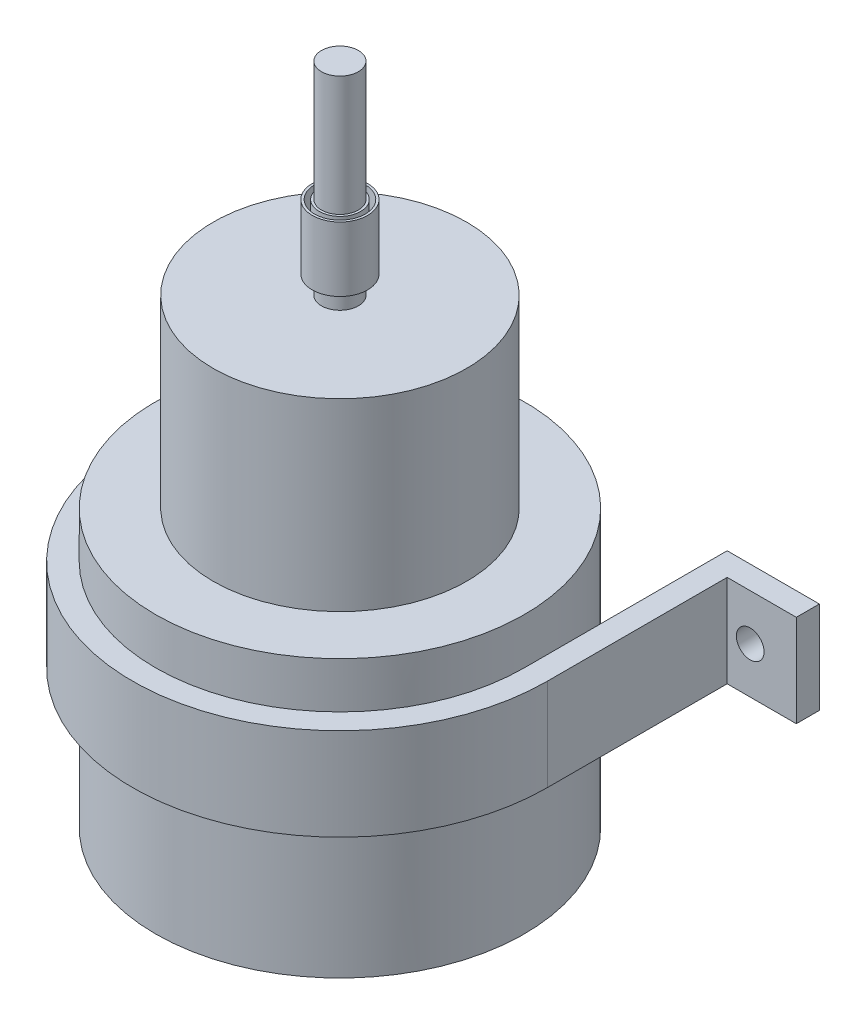
ISO-10303-21;
HEADER;
FILE_DESCRIPTION(('STEP AP214'),'2;1');
FILE_NAME('part.step','',(''),(''),'','','');
FILE_SCHEMA(('AUTOMOTIVE_DESIGN { 1 0 10303 214 1 1 1 1 }'));
ENDSEC;
DATA;
#1=APPLICATION_CONTEXT('core data for automotive mechanical design processes');
#2=APPLICATION_PROTOCOL_DEFINITION('international standard','automotive_design',2000,#1);
#3=PRODUCT_CONTEXT('',#1,'mechanical');
#4=PRODUCT('Part','Part','',(#3));
#5=PRODUCT_RELATED_PRODUCT_CATEGORY('part','',(#4));
#6=PRODUCT_DEFINITION_FORMATION('','',#4);
#7=PRODUCT_DEFINITION_CONTEXT('part definition',#1,'design');
#8=PRODUCT_DEFINITION('design','',#6,#7);
#9=PRODUCT_DEFINITION_SHAPE('','',#8);
#10=(LENGTH_UNIT() NAMED_UNIT(*) SI_UNIT(.MILLI.,.METRE.));
#11=(NAMED_UNIT(*) PLANE_ANGLE_UNIT() SI_UNIT($,.RADIAN.));
#12=(NAMED_UNIT(*) SI_UNIT($,.STERADIAN.) SOLID_ANGLE_UNIT());
#13=UNCERTAINTY_MEASURE_WITH_UNIT(LENGTH_MEASURE(1.E-05),#10,'distance_accuracy_value','');
#14=(GEOMETRIC_REPRESENTATION_CONTEXT(3) GLOBAL_UNCERTAINTY_ASSIGNED_CONTEXT((#13)) GLOBAL_UNIT_ASSIGNED_CONTEXT((#10,
#11,#12)) REPRESENTATION_CONTEXT('',''));
#15=CARTESIAN_POINT('',(0.,0.,0.));
#16=DIRECTION('',(0.,0.,1.));
#17=DIRECTION('',(1.,0.,0.));
#18=AXIS2_PLACEMENT_3D('',#15,#16,#17);
#19=CARTESIAN_POINT('',(0.,59.,0.));
#20=DIRECTION('',(0.,-1.,0.));
#21=DIRECTION('',(0.,0.,-1.));
#22=AXIS2_PLACEMENT_3D('',#19,#20,#21);
#23=CYLINDRICAL_SURFACE('',#22,2.75);
#24=CARTESIAN_POINT('',(0.,59.,0.));
#25=DIRECTION('',(0.,1.,0.));
#26=DIRECTION('',(0.,0.,1.));
#27=AXIS2_PLACEMENT_3D('',#24,#25,#26);
#28=CIRCLE('',#27,2.75);
#29=CARTESIAN_POINT('',(0.,59.,-2.75));
#30=VERTEX_POINT('',#29);
#31=EDGE_CURVE('E60',#30,#30,#28,.T.);
#32=CARTESIAN_POINT('',(0.,52.,0.));
#33=DIRECTION('',(0.,1.,0.));
#34=DIRECTION('',(0.,0.,1.));
#35=AXIS2_PLACEMENT_3D('',#32,#33,#34);
#36=CIRCLE('',#35,2.75);
#37=CARTESIAN_POINT('',(0.,52.,-2.75));
#38=VERTEX_POINT('',#37);
#39=EDGE_CURVE('E66',#38,#38,#36,.T.);
#40=CARTESIAN_POINT('',(0.,59.,-2.75));
#41=CARTESIAN_POINT('',(0.,58.9270833333333,-2.75));
#42=CARTESIAN_POINT('',(0.,58.8541666666667,-2.75));
#43=CARTESIAN_POINT('',(0.,58.7083333333333,-2.75));
#44=CARTESIAN_POINT('',(0.,58.6354166666667,-2.75));
#45=CARTESIAN_POINT('',(0.,58.4895833333333,-2.75));
#46=CARTESIAN_POINT('',(0.,58.4166666666667,-2.75));
#47=CARTESIAN_POINT('',(0.,58.2708333333333,-2.75));
#48=CARTESIAN_POINT('',(0.,58.1979166666667,-2.75));
#49=CARTESIAN_POINT('',(0.,58.0520833333333,-2.75));
#50=CARTESIAN_POINT('',(0.,57.9791666666667,-2.75));
#51=CARTESIAN_POINT('',(0.,57.8333333333333,-2.75));
#52=CARTESIAN_POINT('',(0.,57.7604166666667,-2.75));
#53=CARTESIAN_POINT('',(0.,57.6145833333333,-2.75));
#54=CARTESIAN_POINT('',(0.,57.5416666666667,-2.75));
#55=CARTESIAN_POINT('',(0.,57.3958333333333,-2.75));
#56=CARTESIAN_POINT('',(0.,57.3229166666667,-2.75));
#57=CARTESIAN_POINT('',(0.,57.1770833333333,-2.75));
#58=CARTESIAN_POINT('',(0.,57.1041666666667,-2.75));
#59=CARTESIAN_POINT('',(0.,56.9583333333333,-2.75));
#60=CARTESIAN_POINT('',(0.,56.8854166666667,-2.75));
#61=CARTESIAN_POINT('',(0.,56.7395833333333,-2.75));
#62=CARTESIAN_POINT('',(0.,56.6666666666667,-2.75));
#63=CARTESIAN_POINT('',(0.,56.5208333333333,-2.75));
#64=CARTESIAN_POINT('',(0.,56.4479166666667,-2.75));
#65=CARTESIAN_POINT('',(0.,56.3020833333333,-2.75));
#66=CARTESIAN_POINT('',(0.,56.2291666666667,-2.75));
#67=CARTESIAN_POINT('',(0.,56.0833333333333,-2.75));
#68=CARTESIAN_POINT('',(0.,56.0104166666667,-2.75));
#69=CARTESIAN_POINT('',(0.,55.8645833333333,-2.75));
#70=CARTESIAN_POINT('',(0.,55.7916666666667,-2.75));
#71=CARTESIAN_POINT('',(0.,55.6458333333333,-2.75));
#72=CARTESIAN_POINT('',(0.,55.5729166666667,-2.75));
#73=CARTESIAN_POINT('',(0.,55.4270833333333,-2.75));
#74=CARTESIAN_POINT('',(0.,55.3541666666667,-2.75));
#75=CARTESIAN_POINT('',(0.,55.2083333333333,-2.75));
#76=CARTESIAN_POINT('',(0.,55.1354166666667,-2.75));
#77=CARTESIAN_POINT('',(0.,54.9895833333333,-2.75));
#78=CARTESIAN_POINT('',(0.,54.9166666666667,-2.75));
#79=CARTESIAN_POINT('',(0.,54.7708333333333,-2.75));
#80=CARTESIAN_POINT('',(0.,54.6979166666667,-2.75));
#81=CARTESIAN_POINT('',(0.,54.5520833333333,-2.75));
#82=CARTESIAN_POINT('',(0.,54.4791666666667,-2.75));
#83=CARTESIAN_POINT('',(0.,54.3333333333333,-2.75));
#84=CARTESIAN_POINT('',(0.,54.2604166666667,-2.75));
#85=CARTESIAN_POINT('',(0.,54.1145833333333,-2.75));
#86=CARTESIAN_POINT('',(0.,54.0416666666667,-2.75));
#87=CARTESIAN_POINT('',(0.,53.8958333333333,-2.75));
#88=CARTESIAN_POINT('',(0.,53.8229166666667,-2.75));
#89=CARTESIAN_POINT('',(0.,53.6770833333333,-2.75));
#90=CARTESIAN_POINT('',(0.,53.6041666666667,-2.75));
#91=CARTESIAN_POINT('',(0.,53.4583333333333,-2.75));
#92=CARTESIAN_POINT('',(0.,53.3854166666667,-2.75));
#93=CARTESIAN_POINT('',(0.,53.2395833333333,-2.75));
#94=CARTESIAN_POINT('',(0.,53.1666666666667,-2.75));
#95=CARTESIAN_POINT('',(0.,53.0208333333333,-2.75));
#96=CARTESIAN_POINT('',(0.,52.9479166666667,-2.75));
#97=CARTESIAN_POINT('',(0.,52.8020833333333,-2.75));
#98=CARTESIAN_POINT('',(0.,52.7291666666667,-2.75));
#99=CARTESIAN_POINT('',(0.,52.5833333333333,-2.75));
#100=CARTESIAN_POINT('',(0.,52.5104166666667,-2.75));
#101=CARTESIAN_POINT('',(0.,52.3645833333333,-2.75));
#102=CARTESIAN_POINT('',(0.,52.2916666666667,-2.75));
#103=CARTESIAN_POINT('',(0.,52.1458333333333,-2.75));
#104=CARTESIAN_POINT('',(0.,52.0729166666667,-2.75));
#105=CARTESIAN_POINT('',(0.,52.,-2.75));
#106=B_SPLINE_CURVE_WITH_KNOTS('',3,(#40,#41,#42,#43,#44,#45,#46,#47,#48,#49,#50,#51,#52,#53,
#54,#55,#56,#57,#58,#59,#60,#61,#62,#63,#64,#65,#66,#67,#68,#69,#70,#71,#72,#73,#74,#75,#76,#77,
#78,#79,#80,#81,#82,#83,#84,#85,#86,#87,#88,#89,#90,#91,#92,#93,#94,#95,#96,#97,#98,#99,#100,
#101,#102,#103,#104,#105),.UNSPECIFIED.,.F.,.F.,(4,2,2,2,2,2,2,2,2,2,2,2,2,2,2,2,2,2,2,2,2,2,2,
2,2,2,2,2,2,2,2,2,4),(0.,0.218750000000004,0.4375,0.656250000000004,0.875000000000001,1.09375,
1.3125,1.53125,1.75,1.96875000000001,2.1875,2.40625000000001,2.625,2.84375000000001,3.0625,
3.28125000000001,3.5,3.71875000000001,3.9375,4.15625,4.375,4.59375,4.8125,5.03125,5.25,5.46875,
5.68750000000001,5.90625,6.12500000000001,6.34375,6.56250000000001,6.78125,7.00000000000001),.UNSPECIFIED.);
#107=EDGE_CURVE('BSEAM53',#30,#38,#106,.T.);
#108=ORIENTED_EDGE('',*,*,#31,.T.);
#109=ORIENTED_EDGE('',*,*,#39,.F.);
#110=ORIENTED_EDGE('',*,*,#107,.T.);
#111=ORIENTED_EDGE('',*,*,#107,.F.);
#112=EDGE_LOOP('',(#108,#110,#109,#111));
#113=FACE_BOUND('',#112,.T.);
#114=ADVANCED_FACE('F53',(#113),#23,.F.);
#115=CARTESIAN_POINT('',(0.,59.,0.));
#116=DIRECTION('',(0.,-1.,0.));
#117=DIRECTION('',(0.,0.,-1.));
#118=AXIS2_PLACEMENT_3D('',#115,#116,#117);
#119=CYLINDRICAL_SURFACE('',#118,3.);
#120=CARTESIAN_POINT('',(0.,59.,0.));
#121=DIRECTION('',(0.,1.,0.));
#122=DIRECTION('',(0.,0.,1.));
#123=AXIS2_PLACEMENT_3D('',#120,#121,#122);
#124=CIRCLE('',#123,3.);
#125=CARTESIAN_POINT('',(0.,59.,-3.));
#126=VERTEX_POINT('',#125);
#127=EDGE_CURVE('E12',#126,#126,#124,.T.);
#128=CARTESIAN_POINT('',(0.,52.,0.));
#129=DIRECTION('',(0.,1.,0.));
#130=DIRECTION('',(0.,0.,1.));
#131=AXIS2_PLACEMENT_3D('',#128,#129,#130);
#132=CIRCLE('',#131,3.);
#133=CARTESIAN_POINT('',(0.,52.,-3.));
#134=VERTEX_POINT('',#133);
#135=EDGE_CURVE('E56',#134,#134,#132,.T.);
#136=CARTESIAN_POINT('',(0.,59.,-3.));
#137=CARTESIAN_POINT('',(0.,58.9270833333333,-3.));
#138=CARTESIAN_POINT('',(0.,58.8541666666667,-3.));
#139=CARTESIAN_POINT('',(0.,58.7083333333333,-3.));
#140=CARTESIAN_POINT('',(0.,58.6354166666667,-3.));
#141=CARTESIAN_POINT('',(0.,58.4895833333333,-3.));
#142=CARTESIAN_POINT('',(0.,58.4166666666667,-3.));
#143=CARTESIAN_POINT('',(0.,58.2708333333333,-3.));
#144=CARTESIAN_POINT('',(0.,58.1979166666667,-3.));
#145=CARTESIAN_POINT('',(0.,58.0520833333333,-3.));
#146=CARTESIAN_POINT('',(0.,57.9791666666667,-3.));
#147=CARTESIAN_POINT('',(0.,57.8333333333333,-3.));
#148=CARTESIAN_POINT('',(0.,57.7604166666667,-3.));
#149=CARTESIAN_POINT('',(0.,57.6145833333333,-3.));
#150=CARTESIAN_POINT('',(0.,57.5416666666667,-3.));
#151=CARTESIAN_POINT('',(0.,57.3958333333333,-3.));
#152=CARTESIAN_POINT('',(0.,57.3229166666667,-3.));
#153=CARTESIAN_POINT('',(0.,57.1770833333333,-3.));
#154=CARTESIAN_POINT('',(0.,57.1041666666667,-3.));
#155=CARTESIAN_POINT('',(0.,56.9583333333333,-3.));
#156=CARTESIAN_POINT('',(0.,56.8854166666667,-3.));
#157=CARTESIAN_POINT('',(0.,56.7395833333333,-3.));
#158=CARTESIAN_POINT('',(0.,56.6666666666667,-3.));
#159=CARTESIAN_POINT('',(0.,56.5208333333333,-3.));
#160=CARTESIAN_POINT('',(0.,56.4479166666667,-3.));
#161=CARTESIAN_POINT('',(0.,56.3020833333333,-3.));
#162=CARTESIAN_POINT('',(0.,56.2291666666667,-3.));
#163=CARTESIAN_POINT('',(0.,56.0833333333333,-3.));
#164=CARTESIAN_POINT('',(0.,56.0104166666667,-3.));
#165=CARTESIAN_POINT('',(0.,55.8645833333333,-3.));
#166=CARTESIAN_POINT('',(0.,55.7916666666667,-3.));
#167=CARTESIAN_POINT('',(0.,55.6458333333333,-3.));
#168=CARTESIAN_POINT('',(0.,55.5729166666667,-3.));
#169=CARTESIAN_POINT('',(0.,55.4270833333333,-3.));
#170=CARTESIAN_POINT('',(0.,55.3541666666667,-3.));
#171=CARTESIAN_POINT('',(0.,55.2083333333333,-3.));
#172=CARTESIAN_POINT('',(0.,55.1354166666667,-3.));
#173=CARTESIAN_POINT('',(0.,54.9895833333333,-3.));
#174=CARTESIAN_POINT('',(0.,54.9166666666667,-3.));
#175=CARTESIAN_POINT('',(0.,54.7708333333333,-3.));
#176=CARTESIAN_POINT('',(0.,54.6979166666667,-3.));
#177=CARTESIAN_POINT('',(0.,54.5520833333333,-3.));
#178=CARTESIAN_POINT('',(0.,54.4791666666667,-3.));
#179=CARTESIAN_POINT('',(0.,54.3333333333333,-3.));
#180=CARTESIAN_POINT('',(0.,54.2604166666667,-3.));
#181=CARTESIAN_POINT('',(0.,54.1145833333333,-3.));
#182=CARTESIAN_POINT('',(0.,54.0416666666667,-3.));
#183=CARTESIAN_POINT('',(0.,53.8958333333333,-3.));
#184=CARTESIAN_POINT('',(0.,53.8229166666667,-3.));
#185=CARTESIAN_POINT('',(0.,53.6770833333333,-3.));
#186=CARTESIAN_POINT('',(0.,53.6041666666667,-3.));
#187=CARTESIAN_POINT('',(0.,53.4583333333333,-3.));
#188=CARTESIAN_POINT('',(0.,53.3854166666667,-3.));
#189=CARTESIAN_POINT('',(0.,53.2395833333333,-3.));
#190=CARTESIAN_POINT('',(0.,53.1666666666667,-3.));
#191=CARTESIAN_POINT('',(0.,53.0208333333333,-3.));
#192=CARTESIAN_POINT('',(0.,52.9479166666667,-3.));
#193=CARTESIAN_POINT('',(0.,52.8020833333333,-3.));
#194=CARTESIAN_POINT('',(0.,52.7291666666667,-3.));
#195=CARTESIAN_POINT('',(0.,52.5833333333333,-3.));
#196=CARTESIAN_POINT('',(0.,52.5104166666667,-3.));
#197=CARTESIAN_POINT('',(0.,52.3645833333333,-3.));
#198=CARTESIAN_POINT('',(0.,52.2916666666667,-3.));
#199=CARTESIAN_POINT('',(0.,52.1458333333333,-3.));
#200=CARTESIAN_POINT('',(0.,52.0729166666667,-3.));
#201=CARTESIAN_POINT('',(0.,52.,-3.));
#202=B_SPLINE_CURVE_WITH_KNOTS('',3,(#136,#137,#138,#139,#140,#141,#142,#143,#144,#145,#146,
#147,#148,#149,#150,#151,#152,#153,#154,#155,#156,#157,#158,#159,#160,#161,#162,#163,#164,#165,
#166,#167,#168,#169,#170,#171,#172,#173,#174,#175,#176,#177,#178,#179,#180,#181,#182,#183,#184,
#185,#186,#187,#188,#189,#190,#191,#192,#193,#194,#195,#196,#197,#198,#199,#200,#201),
.UNSPECIFIED.,.F.,.F.,(4,2,2,2,2,2,2,2,2,2,2,2,2,2,2,2,2,2,2,2,2,2,2,2,2,2,2,2,2,2,2,2,4),(0.,
0.218749999999997,0.437499999999993,0.656249999999997,0.874999999999994,1.09375,
1.31249999999999,1.53125,1.74999999999999,1.96875,2.1875,2.40625,2.625,2.84375,3.0625,3.28125,
3.5,3.71875,3.9375,4.15624999999999,4.375,4.59374999999999,4.8125,5.03124999999999,5.25,
5.46874999999999,5.6875,5.90624999999999,6.125,6.34375,6.5625,6.78125,7.),.UNSPECIFIED.);
#203=EDGE_CURVE('BSEAM73',#126,#134,#202,.T.);
#204=ORIENTED_EDGE('',*,*,#127,.F.);
#205=ORIENTED_EDGE('',*,*,#135,.T.);
#206=ORIENTED_EDGE('',*,*,#203,.T.);
#207=ORIENTED_EDGE('',*,*,#203,.F.);
#208=EDGE_LOOP('',(#204,#206,#205,#207));
#209=FACE_BOUND('',#208,.T.);
#210=ADVANCED_FACE('F73',(#209),#119,.T.);
#211=CARTESIAN_POINT('',(0.,59.,0.));
#212=DIRECTION('',(0.,1.,0.));
#213=DIRECTION('',(0.,0.,1.));
#214=AXIS2_PLACEMENT_3D('',#211,#212,#213);
#215=PLANE('',#214);
#216=ORIENTED_EDGE('',*,*,#31,.F.);
#217=EDGE_LOOP('',(#216));
#218=FACE_BOUND('',#217,.T.);
#219=ORIENTED_EDGE('',*,*,#127,.T.);
#220=EDGE_LOOP('',(#219));
#221=FACE_BOUND('',#220,.T.);
#222=ADVANCED_FACE('F77',(#218,#221),#215,.T.);
#223=CARTESIAN_POINT('',(0.,52.,0.));
#224=DIRECTION('',(0.,1.,0.));
#225=DIRECTION('',(0.,0.,1.));
#226=AXIS2_PLACEMENT_3D('',#223,#224,#225);
#227=PLANE('',#226);
#228=ORIENTED_EDGE('',*,*,#39,.T.);
#229=EDGE_LOOP('',(#228));
#230=FACE_BOUND('',#229,.T.);
#231=ORIENTED_EDGE('',*,*,#135,.F.);
#232=EDGE_LOOP('',(#231));
#233=FACE_BOUND('',#232,.T.);
#234=ADVANCED_FACE('F75',(#230,#233),#227,.F.);
#235=CLOSED_SHELL('',(#114,#210,#222,#234));
#236=MANIFOLD_SOLID_BREP('B2',#235);
#237=CARTESIAN_POINT('',(0.,72.,0.));
#238=DIRECTION('',(0.,-1.,0.));
#239=DIRECTION('',(0.,0.,-1.));
#240=AXIS2_PLACEMENT_3D('',#237,#238,#239);
#241=CYLINDRICAL_SURFACE('',#240,2.);
#242=CARTESIAN_POINT('',(0.,50.,0.));
#243=DIRECTION('',(0.,1.,0.));
#244=DIRECTION('',(0.,0.,1.));
#245=AXIS2_PLACEMENT_3D('',#242,#243,#244);
#246=CIRCLE('',#245,2.);
#247=CARTESIAN_POINT('',(0.,50.,2.));
#248=VERTEX_POINT('',#247);
#249=EDGE_CURVE('E281',#248,#248,#246,.T.);
#250=ORIENTED_EDGE('',*,*,#249,.T.);
#251=EDGE_LOOP('',(#250));
#252=FACE_BOUND('',#251,.T.);
#253=CARTESIAN_POINT('',(0.,52.,0.));
#254=DIRECTION('',(0.,1.,0.));
#255=DIRECTION('',(0.,0.,1.));
#256=AXIS2_PLACEMENT_3D('',#253,#254,#255);
#257=CIRCLE('',#256,2.);
#258=CARTESIAN_POINT('',(0.,52.,2.));
#259=VERTEX_POINT('',#258);
#260=EDGE_CURVE('E51',#259,#259,#257,.T.);
#261=ORIENTED_EDGE('',*,*,#260,.F.);
#262=EDGE_LOOP('',(#261));
#263=FACE_BOUND('',#262,.T.);
#264=ADVANCED_FACE('F123',(#252,#263),#241,.T.);
#265=CARTESIAN_POINT('',(0.,30.,0.));
#266=DIRECTION('',(0.,-1.,0.));
#267=DIRECTION('',(0.,0.,-1.));
#268=AXIS2_PLACEMENT_3D('',#265,#266,#267);
#269=CYLINDRICAL_SURFACE('',#268,20.);
#270=CARTESIAN_POINT('',(0.,0.,0.));
#271=DIRECTION('',(0.,1.,0.));
#272=DIRECTION('',(0.,0.,1.));
#273=AXIS2_PLACEMENT_3D('',#270,#271,#272);
#274=CIRCLE('',#273,20.);
#275=CARTESIAN_POINT('',(0.,0.,20.));
#276=VERTEX_POINT('',#275);
#277=EDGE_CURVE('E312',#276,#276,#274,.T.);
#278=ORIENTED_EDGE('',*,*,#277,.T.);
#279=EDGE_LOOP('',(#278));
#280=FACE_BOUND('',#279,.T.);
#281=CARTESIAN_POINT('',(0.,30.,0.));
#282=DIRECTION('',(0.,1.,0.));
#283=DIRECTION('',(0.,0.,1.));
#284=AXIS2_PLACEMENT_3D('',#281,#282,#283);
#285=CIRCLE('',#284,20.);
#286=CARTESIAN_POINT('',(0.,30.,20.));
#287=VERTEX_POINT('',#286);
#288=EDGE_CURVE('E315',#287,#287,#285,.T.);
#289=ORIENTED_EDGE('',*,*,#288,.F.);
#290=EDGE_LOOP('',(#289));
#291=FACE_BOUND('',#290,.T.);
#292=CARTESIAN_POINT('',(0.,15.,0.));
#293=DIRECTION('',(0.,1.,0.));
#294=DIRECTION('',(0.,0.,1.));
#295=AXIS2_PLACEMENT_3D('',#292,#293,#294);
#296=CIRCLE('',#295,20.);
#297=CARTESIAN_POINT('',(-20.,15.,0.));
#298=VERTEX_POINT('',#297);
#299=CARTESIAN_POINT('',(20.,15.,0.));
#300=VERTEX_POINT('',#299);
#301=EDGE_CURVE('E384',#298,#300,#296,.T.);
#302=ORIENTED_EDGE('',*,*,#301,.F.);
#303=DIRECTION('',(0.,1.,0.));
#304=VECTOR('',#303,1.);
#305=CARTESIAN_POINT('',(-20.,15.,0.));
#306=LINE('',#305,#304);
#307=CARTESIAN_POINT('',(-20.,25.,0.));
#308=VERTEX_POINT('',#307);
#309=EDGE_CURVE('E292',#298,#308,#306,.T.);
#310=ORIENTED_EDGE('',*,*,#309,.T.);
#311=CARTESIAN_POINT('',(0.,25.,0.));
#312=DIRECTION('',(0.,1.,0.));
#313=DIRECTION('',(0.,0.,1.));
#314=AXIS2_PLACEMENT_3D('',#311,#312,#313);
#315=CIRCLE('',#314,20.);
#316=CARTESIAN_POINT('',(20.,25.,0.));
#317=VERTEX_POINT('',#316);
#318=EDGE_CURVE('E261',#308,#317,#315,.T.);
#319=ORIENTED_EDGE('',*,*,#318,.T.);
#320=DIRECTION('',(0.,1.,0.));
#321=VECTOR('',#320,1.);
#322=CARTESIAN_POINT('',(20.,15.,0.));
#323=LINE('',#322,#321);
#324=EDGE_CURVE('E295',#300,#317,#323,.T.);
#325=ORIENTED_EDGE('',*,*,#324,.F.);
#326=EDGE_LOOP('',(#302,#310,#319,#325));
#327=FACE_BOUND('',#326,.T.);
#328=ADVANCED_FACE('F125',(#280,#291,#327),#269,.T.);
#329=CARTESIAN_POINT('',(0.,30.,0.));
#330=DIRECTION('',(0.,1.,0.));
#331=DIRECTION('',(0.,0.,1.));
#332=AXIS2_PLACEMENT_3D('',#329,#330,#331);
#333=PLANE('',#332);
#334=CARTESIAN_POINT('',(0.,30.,0.));
#335=DIRECTION('',(0.,1.,0.));
#336=DIRECTION('',(0.,0.,1.));
#337=AXIS2_PLACEMENT_3D('',#334,#335,#336);
#338=CIRCLE('',#337,13.75);
#339=CARTESIAN_POINT('',(0.,30.,13.75));
#340=VERTEX_POINT('',#339);
#341=EDGE_CURVE('E131',#340,#340,#338,.T.);
#342=ORIENTED_EDGE('',*,*,#341,.F.);
#343=EDGE_LOOP('',(#342));
#344=FACE_BOUND('',#343,.T.);
#345=ORIENTED_EDGE('',*,*,#288,.T.);
#346=EDGE_LOOP('',(#345));
#347=FACE_BOUND('',#346,.T.);
#348=ADVANCED_FACE('F325',(#344,#347),#333,.T.);
#349=CARTESIAN_POINT('',(0.,0.,0.));
#350=DIRECTION('',(0.,1.,0.));
#351=DIRECTION('',(0.,0.,1.));
#352=AXIS2_PLACEMENT_3D('',#349,#350,#351);
#353=PLANE('',#352);
#354=ORIENTED_EDGE('',*,*,#277,.F.);
#355=EDGE_LOOP('',(#354));
#356=FACE_BOUND('',#355,.T.);
#357=ADVANCED_FACE('F322',(#356),#353,.F.);
#358=CARTESIAN_POINT('',(0.,50.,0.));
#359=DIRECTION('',(0.,-1.,0.));
#360=DIRECTION('',(0.,0.,-1.));
#361=AXIS2_PLACEMENT_3D('',#358,#359,#360);
#362=CYLINDRICAL_SURFACE('',#361,13.75);
#363=CARTESIAN_POINT('',(0.,50.,0.));
#364=DIRECTION('',(0.,1.,0.));
#365=DIRECTION('',(0.,0.,1.));
#366=AXIS2_PLACEMENT_3D('',#363,#364,#365);
#367=CIRCLE('',#366,13.75);
#368=CARTESIAN_POINT('',(0.,50.,13.75));
#369=VERTEX_POINT('',#368);
#370=EDGE_CURVE('E307',#369,#369,#367,.T.);
#371=ORIENTED_EDGE('',*,*,#370,.F.);
#372=EDGE_LOOP('',(#371));
#373=FACE_BOUND('',#372,.T.);
#374=ORIENTED_EDGE('',*,*,#341,.T.);
#375=EDGE_LOOP('',(#374));
#376=FACE_BOUND('',#375,.T.);
#377=ADVANCED_FACE('F324',(#373,#376),#362,.T.);
#378=CARTESIAN_POINT('',(0.,50.,0.));
#379=DIRECTION('',(0.,1.,0.));
#380=DIRECTION('',(0.,0.,1.));
#381=AXIS2_PLACEMENT_3D('',#378,#379,#380);
#382=PLANE('',#381);
#383=ORIENTED_EDGE('',*,*,#249,.F.);
#384=EDGE_LOOP('',(#383));
#385=FACE_BOUND('',#384,.T.);
#386=ORIENTED_EDGE('',*,*,#370,.T.);
#387=EDGE_LOOP('',(#386));
#388=FACE_BOUND('',#387,.T.);
#389=ADVANCED_FACE('F330',(#385,#388),#382,.T.);
#390=CARTESIAN_POINT('',(20.,15.,-19.5));
#391=DIRECTION('',(0.,0.,1.));
#392=DIRECTION('',(1.,0.,0.));
#393=AXIS2_PLACEMENT_3D('',#390,#391,#392);
#394=PLANE('',#393);
#395=CARTESIAN_POINT('',(25.,20.,-19.5));
#396=DIRECTION('',(0.,0.,1.));
#397=DIRECTION('',(1.,0.,0.));
#398=AXIS2_PLACEMENT_3D('',#395,#396,#397);
#399=CIRCLE('',#398,1.5);
#400=CARTESIAN_POINT('',(26.5,20.,-19.5));
#401=VERTEX_POINT('',#400);
#402=EDGE_CURVE('E371',#401,#401,#399,.T.);
#403=ORIENTED_EDGE('',*,*,#402,.F.);
#404=EDGE_LOOP('',(#403));
#405=FACE_BOUND('',#404,.T.);
#406=DIRECTION('',(1.,0.,0.));
#407=VECTOR('',#406,1.);
#408=CARTESIAN_POINT('',(20.,25.,-19.5));
#409=LINE('',#408,#407);
#410=CARTESIAN_POINT('',(22.5,25.,-19.5));
#411=VERTEX_POINT('',#410);
#412=CARTESIAN_POINT('',(30.,25.,-19.5));
#413=VERTEX_POINT('',#412);
#414=EDGE_CURVE('E251',#411,#413,#409,.T.);
#415=ORIENTED_EDGE('',*,*,#414,.F.);
#416=DIRECTION('',(0.,1.,0.));
#417=VECTOR('',#416,1.);
#418=CARTESIAN_POINT('',(22.5,15.,-19.5));
#419=LINE('',#418,#417);
#420=CARTESIAN_POINT('',(22.5,15.,-19.5));
#421=VERTEX_POINT('',#420);
#422=EDGE_CURVE('E147',#421,#411,#419,.T.);
#423=ORIENTED_EDGE('',*,*,#422,.F.);
#424=DIRECTION('',(1.,0.,0.));
#425=VECTOR('',#424,1.);
#426=CARTESIAN_POINT('',(20.,15.,-19.5));
#427=LINE('',#426,#425);
#428=CARTESIAN_POINT('',(30.,15.,-19.5));
#429=VERTEX_POINT('',#428);
#430=EDGE_CURVE('E279',#421,#429,#427,.T.);
#431=ORIENTED_EDGE('',*,*,#430,.T.);
#432=DIRECTION('',(0.,1.,0.));
#433=VECTOR('',#432,1.);
#434=CARTESIAN_POINT('',(30.,15.,-19.5));
#435=LINE('',#434,#433);
#436=EDGE_CURVE('E250',#429,#413,#435,.T.);
#437=ORIENTED_EDGE('',*,*,#436,.T.);
#438=EDGE_LOOP('',(#415,#423,#431,#437));
#439=FACE_BOUND('',#438,.T.);
#440=ADVANCED_FACE('F418',(#405,#439),#394,.T.);
#441=CARTESIAN_POINT('',(22.5,15.,0.));
#442=DIRECTION('',(1.,0.,0.));
#443=DIRECTION('',(0.,0.,-1.));
#444=AXIS2_PLACEMENT_3D('',#441,#442,#443);
#445=PLANE('',#444);
#446=DIRECTION('',(0.,0.,-1.));
#447=VECTOR('',#446,1.);
#448=CARTESIAN_POINT('',(22.5,25.,0.));
#449=LINE('',#448,#447);
#450=CARTESIAN_POINT('',(22.5,25.,0.));
#451=VERTEX_POINT('',#450);
#452=EDGE_CURVE('E276',#451,#411,#449,.T.);
#453=ORIENTED_EDGE('',*,*,#452,.F.);
#454=DIRECTION('',(0.,1.,0.));
#455=VECTOR('',#454,1.);
#456=CARTESIAN_POINT('',(22.5,15.,0.));
#457=LINE('',#456,#455);
#458=CARTESIAN_POINT('',(22.5,15.,0.));
#459=VERTEX_POINT('',#458);
#460=EDGE_CURVE('E232',#459,#451,#457,.T.);
#461=ORIENTED_EDGE('',*,*,#460,.F.);
#462=DIRECTION('',(0.,0.,-1.));
#463=VECTOR('',#462,1.);
#464=CARTESIAN_POINT('',(22.5,15.,0.));
#465=LINE('',#464,#463);
#466=EDGE_CURVE('E240',#459,#421,#465,.T.);
#467=ORIENTED_EDGE('',*,*,#466,.T.);
#468=ORIENTED_EDGE('',*,*,#422,.T.);
#469=EDGE_LOOP('',(#453,#461,#467,#468));
#470=FACE_BOUND('',#469,.T.);
#471=ADVANCED_FACE('F416',(#470),#445,.T.);
#472=CARTESIAN_POINT('',(0.,15.,0.));
#473=DIRECTION('',(0.,1.,0.));
#474=DIRECTION('',(0.,0.,1.));
#475=AXIS2_PLACEMENT_3D('',#472,#473,#474);
#476=CYLINDRICAL_SURFACE('',#475,22.5);
#477=CARTESIAN_POINT('',(0.,25.,0.));
#478=DIRECTION('',(0.,1.,0.));
#479=DIRECTION('',(1.,0.,0.));
#480=AXIS2_PLACEMENT_3D('',#477,#478,#479);
#481=CIRCLE('',#480,22.5);
#482=CARTESIAN_POINT('',(-22.5,25.,0.));
#483=VERTEX_POINT('',#482);
#484=EDGE_CURVE('E227',#483,#451,#481,.T.);
#485=ORIENTED_EDGE('',*,*,#484,.F.);
#486=DIRECTION('',(0.,1.,0.));
#487=VECTOR('',#486,1.);
#488=CARTESIAN_POINT('',(-22.5,15.,0.));
#489=LINE('',#488,#487);
#490=CARTESIAN_POINT('',(-22.5,15.,0.));
#491=VERTEX_POINT('',#490);
#492=EDGE_CURVE('E221',#491,#483,#489,.T.);
#493=ORIENTED_EDGE('',*,*,#492,.F.);
#494=CARTESIAN_POINT('',(0.,15.,0.));
#495=DIRECTION('',(0.,1.,0.));
#496=DIRECTION('',(1.,0.,0.));
#497=AXIS2_PLACEMENT_3D('',#494,#495,#496);
#498=CIRCLE('',#497,22.5);
#499=EDGE_CURVE('E224',#491,#459,#498,.T.);
#500=ORIENTED_EDGE('',*,*,#499,.T.);
#501=ORIENTED_EDGE('',*,*,#460,.T.);
#502=EDGE_LOOP('',(#485,#493,#500,#501));
#503=FACE_BOUND('',#502,.T.);
#504=ADVANCED_FACE('F223',(#503),#476,.T.);
#505=CARTESIAN_POINT('',(-22.5,15.,0.));
#506=DIRECTION('',(-1.,0.,0.));
#507=DIRECTION('',(0.,0.,1.));
#508=AXIS2_PLACEMENT_3D('',#505,#506,#507);
#509=PLANE('',#508);
#510=DIRECTION('',(0.,0.,-1.));
#511=VECTOR('',#510,1.);
#512=CARTESIAN_POINT('',(-22.5,25.,0.));
#513=LINE('',#512,#511);
#514=CARTESIAN_POINT('',(-22.5,25.,-19.5));
#515=VERTEX_POINT('',#514);
#516=EDGE_CURVE('E273',#515,#483,#513,.F.);
#517=ORIENTED_EDGE('',*,*,#516,.F.);
#518=DIRECTION('',(0.,1.,0.));
#519=VECTOR('',#518,1.);
#520=CARTESIAN_POINT('',(-22.5,15.,-19.5));
#521=LINE('',#520,#519);
#522=CARTESIAN_POINT('',(-22.5,15.,-19.5));
#523=VERTEX_POINT('',#522);
#524=EDGE_CURVE('E233',#523,#515,#521,.T.);
#525=ORIENTED_EDGE('',*,*,#524,.F.);
#526=DIRECTION('',(0.,0.,-1.));
#527=VECTOR('',#526,1.);
#528=CARTESIAN_POINT('',(-22.5,15.,0.));
#529=LINE('',#528,#527);
#530=EDGE_CURVE('E238',#523,#491,#529,.F.);
#531=ORIENTED_EDGE('',*,*,#530,.T.);
#532=ORIENTED_EDGE('',*,*,#492,.T.);
#533=EDGE_LOOP('',(#517,#525,#531,#532));
#534=FACE_BOUND('',#533,.T.);
#535=ADVANCED_FACE('F242',(#534),#509,.T.);
#536=CARTESIAN_POINT('',(-20.,15.,-19.5));
#537=DIRECTION('',(0.,0.,1.));
#538=DIRECTION('',(1.,0.,0.));
#539=AXIS2_PLACEMENT_3D('',#536,#537,#538);
#540=PLANE('',#539);
#541=CARTESIAN_POINT('',(-25.,20.,-19.5));
#542=DIRECTION('',(0.,0.,1.));
#543=DIRECTION('',(1.,0.,0.));
#544=AXIS2_PLACEMENT_3D('',#541,#542,#543);
#545=CIRCLE('',#544,1.5);
#546=CARTESIAN_POINT('',(-23.5,20.,-19.5));
#547=VERTEX_POINT('',#546);
#548=EDGE_CURVE('E255',#547,#547,#545,.T.);
#549=ORIENTED_EDGE('',*,*,#548,.F.);
#550=EDGE_LOOP('',(#549));
#551=FACE_BOUND('',#550,.T.);
#552=DIRECTION('',(1.,0.,0.));
#553=VECTOR('',#552,1.);
#554=CARTESIAN_POINT('',(-20.,25.,-19.5));
#555=LINE('',#554,#553);
#556=CARTESIAN_POINT('',(-30.,25.,-19.5));
#557=VERTEX_POINT('',#556);
#558=EDGE_CURVE('E270',#557,#515,#555,.T.);
#559=ORIENTED_EDGE('',*,*,#558,.F.);
#560=DIRECTION('',(0.,1.,0.));
#561=VECTOR('',#560,1.);
#562=CARTESIAN_POINT('',(-30.,15.,-19.5));
#563=LINE('',#562,#561);
#564=CARTESIAN_POINT('',(-30.,15.,-19.5));
#565=VERTEX_POINT('',#564);
#566=EDGE_CURVE('E284',#565,#557,#563,.T.);
#567=ORIENTED_EDGE('',*,*,#566,.F.);
#568=DIRECTION('',(1.,0.,0.));
#569=VECTOR('',#568,1.);
#570=CARTESIAN_POINT('',(-20.,15.,-19.5));
#571=LINE('',#570,#569);
#572=EDGE_CURVE('E243',#565,#523,#571,.T.);
#573=ORIENTED_EDGE('',*,*,#572,.T.);
#574=ORIENTED_EDGE('',*,*,#524,.T.);
#575=EDGE_LOOP('',(#559,#567,#573,#574));
#576=FACE_BOUND('',#575,.T.);
#577=ADVANCED_FACE('F415',(#551,#576),#540,.T.);
#578=CARTESIAN_POINT('',(-30.,15.,-19.5));
#579=DIRECTION('',(1.,0.,0.));
#580=DIRECTION('',(0.,0.,-1.));
#581=AXIS2_PLACEMENT_3D('',#578,#579,#580);
#582=PLANE('',#581);
#583=DIRECTION('',(0.,0.,-1.));
#584=VECTOR('',#583,1.);
#585=CARTESIAN_POINT('',(-30.,25.,-19.5));
#586=LINE('',#585,#584);
#587=CARTESIAN_POINT('',(-30.,25.,-22.));
#588=VERTEX_POINT('',#587);
#589=EDGE_CURVE('E268',#557,#588,#586,.T.);
#590=ORIENTED_EDGE('',*,*,#589,.T.);
#591=DIRECTION('',(0.,1.,0.));
#592=VECTOR('',#591,1.);
#593=CARTESIAN_POINT('',(-30.,15.,-22.));
#594=LINE('',#593,#592);
#595=CARTESIAN_POINT('',(-30.,15.,-22.));
#596=VERTEX_POINT('',#595);
#597=EDGE_CURVE('E286',#596,#588,#594,.T.);
#598=ORIENTED_EDGE('',*,*,#597,.F.);
#599=DIRECTION('',(0.,0.,-1.));
#600=VECTOR('',#599,1.);
#601=CARTESIAN_POINT('',(-30.,15.,-19.5));
#602=LINE('',#601,#600);
#603=EDGE_CURVE('E245',#565,#596,#602,.T.);
#604=ORIENTED_EDGE('',*,*,#603,.F.);
#605=ORIENTED_EDGE('',*,*,#566,.T.);
#606=EDGE_LOOP('',(#590,#598,#604,#605));
#607=FACE_BOUND('',#606,.T.);
#608=ADVANCED_FACE('F394',(#607),#582,.F.);
#609=CARTESIAN_POINT('',(-20.,15.,-22.));
#610=DIRECTION('',(0.,0.,1.));
#611=DIRECTION('',(1.,0.,0.));
#612=AXIS2_PLACEMENT_3D('',#609,#610,#611);
#613=PLANE('',#612);
#614=CARTESIAN_POINT('',(-25.,20.,-22.));
#615=DIRECTION('',(0.,0.,-1.));
#616=DIRECTION('',(1.,0.,0.));
#617=AXIS2_PLACEMENT_3D('',#614,#615,#616);
#618=CIRCLE('',#617,1.5);
#619=CARTESIAN_POINT('',(-23.5,20.,-22.));
#620=VERTEX_POINT('',#619);
#621=EDGE_CURVE('E363',#620,#620,#618,.T.);
#622=ORIENTED_EDGE('',*,*,#621,.F.);
#623=EDGE_LOOP('',(#622));
#624=FACE_BOUND('',#623,.T.);
#625=DIRECTION('',(1.,0.,0.));
#626=VECTOR('',#625,1.);
#627=CARTESIAN_POINT('',(-20.,25.,-22.));
#628=LINE('',#627,#626);
#629=CARTESIAN_POINT('',(-20.,25.,-22.));
#630=VERTEX_POINT('',#629);
#631=EDGE_CURVE('E266',#588,#630,#628,.T.);
#632=ORIENTED_EDGE('',*,*,#631,.T.);
#633=DIRECTION('',(0.,1.,0.));
#634=VECTOR('',#633,1.);
#635=CARTESIAN_POINT('',(-20.,15.,-22.));
#636=LINE('',#635,#634);
#637=CARTESIAN_POINT('',(-20.,15.,-22.));
#638=VERTEX_POINT('',#637);
#639=EDGE_CURVE('E289',#638,#630,#636,.T.);
#640=ORIENTED_EDGE('',*,*,#639,.F.);
#641=DIRECTION('',(1.,0.,0.));
#642=VECTOR('',#641,1.);
#643=CARTESIAN_POINT('',(-20.,15.,-22.));
#644=LINE('',#643,#642);
#645=EDGE_CURVE('E388',#596,#638,#644,.T.);
#646=ORIENTED_EDGE('',*,*,#645,.F.);
#647=ORIENTED_EDGE('',*,*,#597,.T.);
#648=EDGE_LOOP('',(#632,#640,#646,#647));
#649=FACE_BOUND('',#648,.T.);
#650=ADVANCED_FACE('F398',(#624,#649),#613,.F.);
#651=CARTESIAN_POINT('',(-20.,15.,0.));
#652=DIRECTION('',(-1.,0.,0.));
#653=DIRECTION('',(0.,0.,1.));
#654=AXIS2_PLACEMENT_3D('',#651,#652,#653);
#655=PLANE('',#654);
#656=DIRECTION('',(0.,0.,1.));
#657=VECTOR('',#656,1.);
#658=CARTESIAN_POINT('',(-20.,25.,0.));
#659=LINE('',#658,#657);
#660=EDGE_CURVE('E264',#630,#308,#659,.T.);
#661=ORIENTED_EDGE('',*,*,#660,.T.);
#662=ORIENTED_EDGE('',*,*,#309,.F.);
#663=DIRECTION('',(0.,0.,1.));
#664=VECTOR('',#663,1.);
#665=CARTESIAN_POINT('',(-20.,15.,0.));
#666=LINE('',#665,#664);
#667=EDGE_CURVE('E386',#638,#298,#666,.T.);
#668=ORIENTED_EDGE('',*,*,#667,.F.);
#669=ORIENTED_EDGE('',*,*,#639,.T.);
#670=EDGE_LOOP('',(#661,#662,#668,#669));
#671=FACE_BOUND('',#670,.T.);
#672=ADVANCED_FACE('F403',(#671),#655,.F.);
#673=CARTESIAN_POINT('',(20.,15.,0.));
#674=DIRECTION('',(1.,0.,0.));
#675=DIRECTION('',(0.,0.,-1.));
#676=AXIS2_PLACEMENT_3D('',#673,#674,#675);
#677=PLANE('',#676);
#678=DIRECTION('',(0.,0.,-1.));
#679=VECTOR('',#678,1.);
#680=CARTESIAN_POINT('',(20.,25.,0.));
#681=LINE('',#680,#679);
#682=CARTESIAN_POINT('',(20.,25.,-22.));
#683=VERTEX_POINT('',#682);
#684=EDGE_CURVE('E138',#317,#683,#681,.T.);
#685=ORIENTED_EDGE('',*,*,#684,.T.);
#686=DIRECTION('',(0.,1.,0.));
#687=VECTOR('',#686,1.);
#688=CARTESIAN_POINT('',(20.,15.,-22.));
#689=LINE('',#688,#687);
#690=CARTESIAN_POINT('',(20.,15.,-22.));
#691=VERTEX_POINT('',#690);
#692=EDGE_CURVE('E297',#691,#683,#689,.T.);
#693=ORIENTED_EDGE('',*,*,#692,.F.);
#694=DIRECTION('',(0.,0.,-1.));
#695=VECTOR('',#694,1.);
#696=CARTESIAN_POINT('',(20.,15.,0.));
#697=LINE('',#696,#695);
#698=EDGE_CURVE('E382',#300,#691,#697,.T.);
#699=ORIENTED_EDGE('',*,*,#698,.F.);
#700=ORIENTED_EDGE('',*,*,#324,.T.);
#701=EDGE_LOOP('',(#685,#693,#699,#700));
#702=FACE_BOUND('',#701,.T.);
#703=ADVANCED_FACE('F410',(#702),#677,.F.);
#704=CARTESIAN_POINT('',(20.,15.,-22.));
#705=DIRECTION('',(0.,0.,1.));
#706=DIRECTION('',(1.,0.,0.));
#707=AXIS2_PLACEMENT_3D('',#704,#705,#706);
#708=PLANE('',#707);
#709=CARTESIAN_POINT('',(25.,20.,-22.));
#710=DIRECTION('',(0.,0.,-1.));
#711=DIRECTION('',(-1.,0.,0.));
#712=AXIS2_PLACEMENT_3D('',#709,#710,#711);
#713=CIRCLE('',#712,1.5);
#714=CARTESIAN_POINT('',(23.5,20.,-22.));
#715=VERTEX_POINT('',#714);
#716=EDGE_CURVE('E368',#715,#715,#713,.T.);
#717=ORIENTED_EDGE('',*,*,#716,.F.);
#718=EDGE_LOOP('',(#717));
#719=FACE_BOUND('',#718,.T.);
#720=DIRECTION('',(1.,0.,0.));
#721=VECTOR('',#720,1.);
#722=CARTESIAN_POINT('',(20.,25.,-22.));
#723=LINE('',#722,#721);
#724=CARTESIAN_POINT('',(30.,25.,-22.));
#725=VERTEX_POINT('',#724);
#726=EDGE_CURVE('E258',#683,#725,#723,.T.);
#727=ORIENTED_EDGE('',*,*,#726,.T.);
#728=DIRECTION('',(0.,1.,0.));
#729=VECTOR('',#728,1.);
#730=CARTESIAN_POINT('',(30.,15.,-22.));
#731=LINE('',#730,#729);
#732=CARTESIAN_POINT('',(30.,15.,-22.));
#733=VERTEX_POINT('',#732);
#734=EDGE_CURVE('E300',#733,#725,#731,.T.);
#735=ORIENTED_EDGE('',*,*,#734,.F.);
#736=DIRECTION('',(1.,0.,0.));
#737=VECTOR('',#736,1.);
#738=CARTESIAN_POINT('',(20.,15.,-22.));
#739=LINE('',#738,#737);
#740=EDGE_CURVE('E380',#691,#733,#739,.T.);
#741=ORIENTED_EDGE('',*,*,#740,.F.);
#742=ORIENTED_EDGE('',*,*,#692,.T.);
#743=EDGE_LOOP('',(#727,#735,#741,#742));
#744=FACE_BOUND('',#743,.T.);
#745=ADVANCED_FACE('F444',(#719,#744),#708,.F.);
#746=CARTESIAN_POINT('',(30.,15.,-22.));
#747=DIRECTION('',(-1.,0.,0.));
#748=DIRECTION('',(0.,0.,1.));
#749=AXIS2_PLACEMENT_3D('',#746,#747,#748);
#750=PLANE('',#749);
#751=DIRECTION('',(0.,0.,1.));
#752=VECTOR('',#751,1.);
#753=CARTESIAN_POINT('',(30.,25.,-22.));
#754=LINE('',#753,#752);
#755=EDGE_CURVE('E254',#725,#413,#754,.T.);
#756=ORIENTED_EDGE('',*,*,#755,.T.);
#757=ORIENTED_EDGE('',*,*,#436,.F.);
#758=DIRECTION('',(0.,0.,1.));
#759=VECTOR('',#758,1.);
#760=CARTESIAN_POINT('',(30.,15.,-22.));
#761=LINE('',#760,#759);
#762=EDGE_CURVE('E193',#733,#429,#761,.T.);
#763=ORIENTED_EDGE('',*,*,#762,.F.);
#764=ORIENTED_EDGE('',*,*,#734,.T.);
#765=EDGE_LOOP('',(#756,#757,#763,#764));
#766=FACE_BOUND('',#765,.T.);
#767=ADVANCED_FACE('F447',(#766),#750,.F.);
#768=CARTESIAN_POINT('',(0.,15.,0.));
#769=DIRECTION('',(0.,1.,0.));
#770=DIRECTION('',(1.,0.,0.));
#771=AXIS2_PLACEMENT_3D('',#768,#769,#770);
#772=PLANE('',#771);
#773=ORIENTED_EDGE('',*,*,#430,.F.);
#774=ORIENTED_EDGE('',*,*,#466,.F.);
#775=ORIENTED_EDGE('',*,*,#499,.F.);
#776=ORIENTED_EDGE('',*,*,#530,.F.);
#777=ORIENTED_EDGE('',*,*,#572,.F.);
#778=ORIENTED_EDGE('',*,*,#603,.T.);
#779=ORIENTED_EDGE('',*,*,#645,.T.);
#780=ORIENTED_EDGE('',*,*,#667,.T.);
#781=ORIENTED_EDGE('',*,*,#301,.T.);
#782=ORIENTED_EDGE('',*,*,#698,.T.);
#783=ORIENTED_EDGE('',*,*,#740,.T.);
#784=ORIENTED_EDGE('',*,*,#762,.T.);
#785=EDGE_LOOP('',(#773,#774,#775,#776,#777,#778,#779,#780,#781,#782,#783,#784));
#786=FACE_BOUND('',#785,.T.);
#787=ADVANCED_FACE('F236',(#786),#772,.F.);
#788=CARTESIAN_POINT('',(0.,25.,0.));
#789=DIRECTION('',(0.,1.,0.));
#790=DIRECTION('',(1.,0.,0.));
#791=AXIS2_PLACEMENT_3D('',#788,#789,#790);
#792=PLANE('',#791);
#793=ORIENTED_EDGE('',*,*,#414,.T.);
#794=ORIENTED_EDGE('',*,*,#755,.F.);
#795=ORIENTED_EDGE('',*,*,#726,.F.);
#796=ORIENTED_EDGE('',*,*,#684,.F.);
#797=ORIENTED_EDGE('',*,*,#318,.F.);
#798=ORIENTED_EDGE('',*,*,#660,.F.);
#799=ORIENTED_EDGE('',*,*,#631,.F.);
#800=ORIENTED_EDGE('',*,*,#589,.F.);
#801=ORIENTED_EDGE('',*,*,#558,.T.);
#802=ORIENTED_EDGE('',*,*,#516,.T.);
#803=ORIENTED_EDGE('',*,*,#484,.T.);
#804=ORIENTED_EDGE('',*,*,#452,.T.);
#805=EDGE_LOOP('',(#793,#794,#795,#796,#797,#798,#799,#800,#801,#802,#803,#804));
#806=FACE_BOUND('',#805,.T.);
#807=ADVANCED_FACE('F412',(#806),#792,.T.);
#808=CARTESIAN_POINT('',(25.,20.,-12.));
#809=DIRECTION('',(0.,0.,-1.));
#810=DIRECTION('',(-1.,0.,0.));
#811=AXIS2_PLACEMENT_3D('',#808,#809,#810);
#812=CYLINDRICAL_SURFACE('',#811,1.5);
#813=ORIENTED_EDGE('',*,*,#402,.T.);
#814=EDGE_LOOP('',(#813));
#815=FACE_BOUND('',#814,.T.);
#816=ORIENTED_EDGE('',*,*,#716,.T.);
#817=EDGE_LOOP('',(#816));
#818=FACE_BOUND('',#817,.T.);
#819=ADVANCED_FACE('F460',(#815,#818),#812,.F.);
#820=CARTESIAN_POINT('',(-25.,20.,-12.));
#821=DIRECTION('',(0.,0.,-1.));
#822=DIRECTION('',(-1.,0.,0.));
#823=AXIS2_PLACEMENT_3D('',#820,#821,#822);
#824=CYLINDRICAL_SURFACE('',#823,1.5);
#825=ORIENTED_EDGE('',*,*,#548,.T.);
#826=EDGE_LOOP('',(#825));
#827=FACE_BOUND('',#826,.T.);
#828=ORIENTED_EDGE('',*,*,#621,.T.);
#829=EDGE_LOOP('',(#828));
#830=FACE_BOUND('',#829,.T.);
#831=ADVANCED_FACE('F462',(#827,#830),#824,.F.);
#832=CARTESIAN_POINT('',(0.,59.,0.));
#833=DIRECTION('',(0.,-1.,0.));
#834=DIRECTION('',(0.,0.,-1.));
#835=AXIS2_PLACEMENT_3D('',#832,#833,#834);
#836=CYLINDRICAL_SURFACE('',#835,2.25);
#837=CARTESIAN_POINT('',(0.,59.,0.));
#838=DIRECTION('',(0.,1.,0.));
#839=DIRECTION('',(0.,0.,1.));
#840=AXIS2_PLACEMENT_3D('',#837,#838,#839);
#841=CIRCLE('',#840,2.25);
#842=CARTESIAN_POINT('',(0.,59.,-2.25));
#843=VERTEX_POINT('',#842);
#844=EDGE_CURVE('E359',#843,#843,#841,.T.);
#845=CARTESIAN_POINT('',(0.,52.,0.));
#846=DIRECTION('',(0.,1.,0.));
#847=DIRECTION('',(0.,0.,1.));
#848=AXIS2_PLACEMENT_3D('',#845,#846,#847);
#849=CIRCLE('',#848,2.25);
#850=CARTESIAN_POINT('',(0.,52.,-2.25));
#851=VERTEX_POINT('',#850);
#852=EDGE_CURVE('E360',#851,#851,#849,.T.);
#853=CARTESIAN_POINT('',(0.,59.,-2.25));
#854=CARTESIAN_POINT('',(0.,58.9270833333333,-2.25));
#855=CARTESIAN_POINT('',(0.,58.8541666666667,-2.25));
#856=CARTESIAN_POINT('',(0.,58.7083333333333,-2.25));
#857=CARTESIAN_POINT('',(0.,58.6354166666667,-2.25));
#858=CARTESIAN_POINT('',(0.,58.4895833333333,-2.25));
#859=CARTESIAN_POINT('',(0.,58.4166666666667,-2.25));
#860=CARTESIAN_POINT('',(0.,58.2708333333333,-2.25));
#861=CARTESIAN_POINT('',(0.,58.1979166666667,-2.25));
#862=CARTESIAN_POINT('',(0.,58.0520833333333,-2.25));
#863=CARTESIAN_POINT('',(0.,57.9791666666667,-2.25));
#864=CARTESIAN_POINT('',(0.,57.8333333333333,-2.25));
#865=CARTESIAN_POINT('',(0.,57.7604166666667,-2.25));
#866=CARTESIAN_POINT('',(0.,57.6145833333333,-2.25));
#867=CARTESIAN_POINT('',(0.,57.5416666666667,-2.25));
#868=CARTESIAN_POINT('',(0.,57.3958333333333,-2.25));
#869=CARTESIAN_POINT('',(0.,57.3229166666667,-2.25));
#870=CARTESIAN_POINT('',(0.,57.1770833333333,-2.25));
#871=CARTESIAN_POINT('',(0.,57.1041666666667,-2.25));
#872=CARTESIAN_POINT('',(0.,56.9583333333333,-2.25));
#873=CARTESIAN_POINT('',(0.,56.8854166666667,-2.25));
#874=CARTESIAN_POINT('',(0.,56.7395833333333,-2.25));
#875=CARTESIAN_POINT('',(0.,56.6666666666667,-2.25));
#876=CARTESIAN_POINT('',(0.,56.5208333333333,-2.25));
#877=CARTESIAN_POINT('',(0.,56.4479166666667,-2.25));
#878=CARTESIAN_POINT('',(0.,56.3020833333333,-2.25));
#879=CARTESIAN_POINT('',(0.,56.2291666666667,-2.25));
#880=CARTESIAN_POINT('',(0.,56.0833333333333,-2.25));
#881=CARTESIAN_POINT('',(0.,56.0104166666667,-2.25));
#882=CARTESIAN_POINT('',(0.,55.8645833333333,-2.25));
#883=CARTESIAN_POINT('',(0.,55.7916666666667,-2.25));
#884=CARTESIAN_POINT('',(0.,55.6458333333333,-2.25));
#885=CARTESIAN_POINT('',(0.,55.5729166666667,-2.25));
#886=CARTESIAN_POINT('',(0.,55.4270833333333,-2.25));
#887=CARTESIAN_POINT('',(0.,55.3541666666667,-2.25));
#888=CARTESIAN_POINT('',(0.,55.2083333333333,-2.25));
#889=CARTESIAN_POINT('',(0.,55.1354166666667,-2.25));
#890=CARTESIAN_POINT('',(0.,54.9895833333333,-2.25));
#891=CARTESIAN_POINT('',(0.,54.9166666666667,-2.25));
#892=CARTESIAN_POINT('',(0.,54.7708333333333,-2.25));
#893=CARTESIAN_POINT('',(0.,54.6979166666667,-2.25));
#894=CARTESIAN_POINT('',(0.,54.5520833333333,-2.25));
#895=CARTESIAN_POINT('',(0.,54.4791666666667,-2.25));
#896=CARTESIAN_POINT('',(0.,54.3333333333333,-2.25));
#897=CARTESIAN_POINT('',(0.,54.2604166666667,-2.25));
#898=CARTESIAN_POINT('',(0.,54.1145833333333,-2.25));
#899=CARTESIAN_POINT('',(0.,54.0416666666667,-2.25));
#900=CARTESIAN_POINT('',(0.,53.8958333333333,-2.25));
#901=CARTESIAN_POINT('',(0.,53.8229166666667,-2.25));
#902=CARTESIAN_POINT('',(0.,53.6770833333333,-2.25));
#903=CARTESIAN_POINT('',(0.,53.6041666666667,-2.25));
#904=CARTESIAN_POINT('',(0.,53.4583333333333,-2.25));
#905=CARTESIAN_POINT('',(0.,53.3854166666667,-2.25));
#906=CARTESIAN_POINT('',(0.,53.2395833333333,-2.25));
#907=CARTESIAN_POINT('',(0.,53.1666666666667,-2.25));
#908=CARTESIAN_POINT('',(0.,53.0208333333333,-2.25));
#909=CARTESIAN_POINT('',(0.,52.9479166666667,-2.25));
#910=CARTESIAN_POINT('',(0.,52.8020833333333,-2.25));
#911=CARTESIAN_POINT('',(0.,52.7291666666667,-2.25));
#912=CARTESIAN_POINT('',(0.,52.5833333333333,-2.25));
#913=CARTESIAN_POINT('',(0.,52.5104166666667,-2.25));
#914=CARTESIAN_POINT('',(0.,52.3645833333333,-2.25));
#915=CARTESIAN_POINT('',(0.,52.2916666666667,-2.25));
#916=CARTESIAN_POINT('',(0.,52.1458333333333,-2.25));
#917=CARTESIAN_POINT('',(0.,52.0729166666667,-2.25));
#918=CARTESIAN_POINT('',(0.,52.,-2.25));
#919=B_SPLINE_CURVE_WITH_KNOTS('',3,(#853,#854,#855,#856,#857,#858,#859,#860,#861,#862,#863,
#864,#865,#866,#867,#868,#869,#870,#871,#872,#873,#874,#875,#876,#877,#878,#879,#880,#881,#882,
#883,#884,#885,#886,#887,#888,#889,#890,#891,#892,#893,#894,#895,#896,#897,#898,#899,#900,#901,
#902,#903,#904,#905,#906,#907,#908,#909,#910,#911,#912,#913,#914,#915,#916,#917,#918),
.UNSPECIFIED.,.F.,.F.,(4,2,2,2,2,2,2,2,2,2,2,2,2,2,2,2,2,2,2,2,2,2,2,2,2,2,2,2,2,2,2,2,4),(0.,
0.218750000000004,0.4375,0.656250000000004,0.875000000000001,1.09375,1.3125,1.53125,1.75,
1.96875000000001,2.1875,2.40625000000001,2.625,2.84375000000001,3.0625,3.28125000000001,3.5,
3.71875000000001,3.9375,4.15625,4.375,4.59375,4.8125,5.03125,5.25,5.46875,5.68750000000001,
5.90625,6.12500000000001,6.34375,6.56250000000001,6.78125,7.00000000000001),.UNSPECIFIED.);
#920=EDGE_CURVE('BSEAM465',#843,#851,#919,.T.);
#921=ORIENTED_EDGE('',*,*,#844,.F.);
#922=ORIENTED_EDGE('',*,*,#852,.T.);
#923=ORIENTED_EDGE('',*,*,#920,.T.);
#924=ORIENTED_EDGE('',*,*,#920,.F.);
#925=EDGE_LOOP('',(#921,#923,#922,#924));
#926=FACE_BOUND('',#925,.T.);
#927=ADVANCED_FACE('F465',(#926),#836,.T.);
#928=CARTESIAN_POINT('',(0.,59.,0.));
#929=DIRECTION('',(0.,1.,0.));
#930=DIRECTION('',(0.,0.,1.));
#931=AXIS2_PLACEMENT_3D('',#928,#929,#930);
#932=PLANE('',#931);
#933=CARTESIAN_POINT('',(0.,59.,0.));
#934=DIRECTION('',(0.,1.,0.));
#935=DIRECTION('',(0.,0.,1.));
#936=AXIS2_PLACEMENT_3D('',#933,#934,#935);
#937=CIRCLE('',#936,2.);
#938=CARTESIAN_POINT('',(0.,59.,2.));
#939=VERTEX_POINT('',#938);
#940=EDGE_CURVE('E356',#939,#939,#937,.T.);
#941=ORIENTED_EDGE('',*,*,#940,.F.);
#942=EDGE_LOOP('',(#941));
#943=FACE_BOUND('',#942,.T.);
#944=ORIENTED_EDGE('',*,*,#844,.T.);
#945=EDGE_LOOP('',(#944));
#946=FACE_BOUND('',#945,.T.);
#947=ADVANCED_FACE('F472',(#943,#946),#932,.T.);
#948=CARTESIAN_POINT('',(0.,52.,0.));
#949=DIRECTION('',(0.,1.,0.));
#950=DIRECTION('',(0.,0.,1.));
#951=AXIS2_PLACEMENT_3D('',#948,#949,#950);
#952=PLANE('',#951);
#953=ORIENTED_EDGE('',*,*,#260,.T.);
#954=EDGE_LOOP('',(#953));
#955=FACE_BOUND('',#954,.T.);
#956=ORIENTED_EDGE('',*,*,#852,.F.);
#957=EDGE_LOOP('',(#956));
#958=FACE_BOUND('',#957,.T.);
#959=ADVANCED_FACE('F351',(#955,#958),#952,.F.);
#960=CARTESIAN_POINT('',(0.,72.,0.));
#961=DIRECTION('',(0.,1.,0.));
#962=DIRECTION('',(0.,0.,1.));
#963=AXIS2_PLACEMENT_3D('',#960,#961,#962);
#964=PLANE('',#963);
#965=CARTESIAN_POINT('',(0.,72.,0.));
#966=DIRECTION('',(0.,1.,0.));
#967=DIRECTION('',(0.,0.,1.));
#968=AXIS2_PLACEMENT_3D('',#965,#966,#967);
#969=CIRCLE('',#968,2.);
#970=CARTESIAN_POINT('',(0.,72.,2.));
#971=VERTEX_POINT('',#970);
#972=EDGE_CURVE('E304',#971,#971,#969,.T.);
#973=ORIENTED_EDGE('',*,*,#972,.T.);
#974=EDGE_LOOP('',(#973));
#975=FACE_BOUND('',#974,.T.);
#976=ADVANCED_FACE('F346',(#975),#964,.T.);
#977=ORIENTED_EDGE('',*,*,#940,.T.);
#978=EDGE_LOOP('',(#977));
#979=FACE_BOUND('',#978,.T.);
#980=ORIENTED_EDGE('',*,*,#972,.F.);
#981=EDGE_LOOP('',(#980));
#982=FACE_BOUND('',#981,.T.);
#983=ADVANCED_FACE('F338',(#979,#982),#241,.T.);
#984=CLOSED_SHELL('',(#264,#328,#348,#357,#377,#389,#440,#471,#504,#535,#577,#608,#650,#672,
#703,#745,#767,#787,#807,#819,#831,#927,#947,#959,#976,#983));
#985=MANIFOLD_SOLID_BREP('B7',#984);
#986=ADVANCED_BREP_SHAPE_REPRESENTATION('',(#18,#236,#985),#14);
#987=SHAPE_DEFINITION_REPRESENTATION(#9,#986);
ENDSEC;
END-ISO-10303-21;
